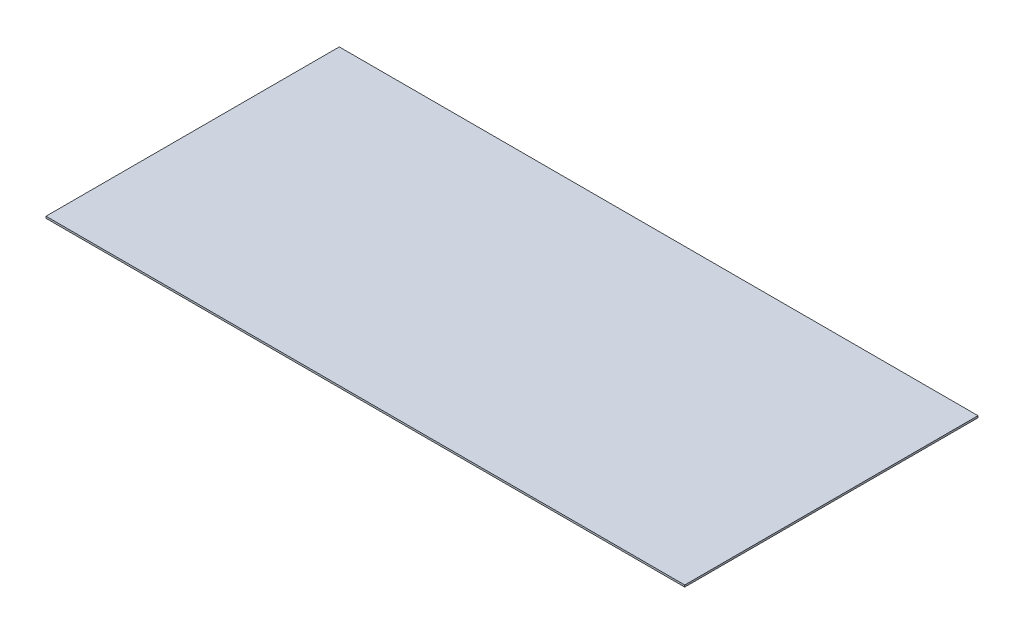
ISO-10303-21;
HEADER;
FILE_DESCRIPTION(('STEP AP214'),'2;1');
FILE_NAME('part.step','',(''),(''),'','','');
FILE_SCHEMA(('AUTOMOTIVE_DESIGN { 1 0 10303 214 1 1 1 1 }'));
ENDSEC;
DATA;
#1=APPLICATION_CONTEXT('core data for automotive mechanical design processes');
#2=APPLICATION_PROTOCOL_DEFINITION('international standard','automotive_design',2000,#1);
#3=PRODUCT_CONTEXT('',#1,'mechanical');
#4=PRODUCT('Part','Part','',(#3));
#5=PRODUCT_RELATED_PRODUCT_CATEGORY('part','',(#4));
#6=PRODUCT_DEFINITION_FORMATION('','',#4);
#7=PRODUCT_DEFINITION_CONTEXT('part definition',#1,'design');
#8=PRODUCT_DEFINITION('design','',#6,#7);
#9=PRODUCT_DEFINITION_SHAPE('','',#8);
#10=(LENGTH_UNIT() NAMED_UNIT(*) SI_UNIT(.MILLI.,.METRE.));
#11=(NAMED_UNIT(*) PLANE_ANGLE_UNIT() SI_UNIT($,.RADIAN.));
#12=(NAMED_UNIT(*) SI_UNIT($,.STERADIAN.) SOLID_ANGLE_UNIT());
#13=UNCERTAINTY_MEASURE_WITH_UNIT(LENGTH_MEASURE(1.E-05),#10,'distance_accuracy_value','');
#14=(GEOMETRIC_REPRESENTATION_CONTEXT(3) GLOBAL_UNCERTAINTY_ASSIGNED_CONTEXT((#13)) GLOBAL_UNIT_ASSIGNED_CONTEXT((#10,
#11,#12)) REPRESENTATION_CONTEXT('',''));
#15=CARTESIAN_POINT('',(0.,0.,0.));
#16=DIRECTION('',(0.,0.,1.));
#17=DIRECTION('',(1.,0.,0.));
#18=AXIS2_PLACEMENT_3D('',#15,#16,#17);
#19=CARTESIAN_POINT('',(0.,3.,0.));
#20=DIRECTION('',(-1.,0.,0.));
#21=DIRECTION('',(0.,0.,1.));
#22=AXIS2_PLACEMENT_3D('',#19,#20,#21);
#23=PLANE('',#22);
#24=DIRECTION('',(0.,0.,-1.));
#25=VECTOR('',#24,1.);
#26=CARTESIAN_POINT('',(0.,0.,0.));
#27=LINE('',#26,#25);
#28=CARTESIAN_POINT('',(0.,0.,472.));
#29=VERTEX_POINT('',#28);
#30=CARTESIAN_POINT('',(0.,0.,0.));
#31=VERTEX_POINT('',#30);
#32=EDGE_CURVE('E96',#29,#31,#27,.T.);
#33=ORIENTED_EDGE('',*,*,#32,.T.);
#34=DIRECTION('',(0.,-1.,0.));
#35=VECTOR('',#34,1.);
#36=CARTESIAN_POINT('',(0.,3.,0.));
#37=LINE('',#36,#35);
#38=CARTESIAN_POINT('',(0.,3.,0.));
#39=VERTEX_POINT('',#38);
#40=EDGE_CURVE('E11',#39,#31,#37,.T.);
#41=ORIENTED_EDGE('',*,*,#40,.F.);
#42=DIRECTION('',(0.,0.,-1.));
#43=VECTOR('',#42,1.);
#44=CARTESIAN_POINT('',(0.,3.,0.));
#45=LINE('',#44,#43);
#46=CARTESIAN_POINT('',(0.,3.,472.));
#47=VERTEX_POINT('',#46);
#48=EDGE_CURVE('E84',#47,#39,#45,.T.);
#49=ORIENTED_EDGE('',*,*,#48,.F.);
#50=DIRECTION('',(0.,-1.,0.));
#51=VECTOR('',#50,1.);
#52=CARTESIAN_POINT('',(0.,3.,472.));
#53=LINE('',#52,#51);
#54=EDGE_CURVE('E92',#47,#29,#53,.T.);
#55=ORIENTED_EDGE('',*,*,#54,.T.);
#56=EDGE_LOOP('',(#33,#41,#49,#55));
#57=FACE_BOUND('',#56,.T.);
#58=ADVANCED_FACE('F33',(#57),#23,.F.);
#59=CARTESIAN_POINT('',(0.,3.,0.));
#60=DIRECTION('',(0.,0.,1.));
#61=DIRECTION('',(1.,0.,0.));
#62=AXIS2_PLACEMENT_3D('',#59,#60,#61);
#63=PLANE('',#62);
#64=DIRECTION('',(-1.,0.,0.));
#65=VECTOR('',#64,1.);
#66=CARTESIAN_POINT('',(0.,0.,0.));
#67=LINE('',#66,#65);
#68=CARTESIAN_POINT('',(-1028.,0.,0.));
#69=VERTEX_POINT('',#68);
#70=EDGE_CURVE('E88',#31,#69,#67,.T.);
#71=ORIENTED_EDGE('',*,*,#70,.T.);
#72=DIRECTION('',(0.,-1.,0.));
#73=VECTOR('',#72,1.);
#74=CARTESIAN_POINT('',(-1028.,3.,0.));
#75=LINE('',#74,#73);
#76=CARTESIAN_POINT('',(-1028.,3.,0.));
#77=VERTEX_POINT('',#76);
#78=EDGE_CURVE('E41',#77,#69,#75,.T.);
#79=ORIENTED_EDGE('',*,*,#78,.F.);
#80=DIRECTION('',(-1.,0.,0.));
#81=VECTOR('',#80,1.);
#82=CARTESIAN_POINT('',(0.,3.,0.));
#83=LINE('',#82,#81);
#84=EDGE_CURVE('E79',#39,#77,#83,.T.);
#85=ORIENTED_EDGE('',*,*,#84,.F.);
#86=ORIENTED_EDGE('',*,*,#40,.T.);
#87=EDGE_LOOP('',(#71,#79,#85,#86));
#88=FACE_BOUND('',#87,.T.);
#89=ADVANCED_FACE('F87',(#88),#63,.F.);
#90=CARTESIAN_POINT('',(-1028.,3.,0.));
#91=DIRECTION('',(1.,0.,0.));
#92=DIRECTION('',(0.,0.,-1.));
#93=AXIS2_PLACEMENT_3D('',#90,#91,#92);
#94=PLANE('',#93);
#95=DIRECTION('',(0.,0.,1.));
#96=VECTOR('',#95,1.);
#97=CARTESIAN_POINT('',(-1028.,0.,0.));
#98=LINE('',#97,#96);
#99=CARTESIAN_POINT('',(-1028.,0.,472.));
#100=VERTEX_POINT('',#99);
#101=EDGE_CURVE('E66',#69,#100,#98,.T.);
#102=ORIENTED_EDGE('',*,*,#101,.T.);
#103=DIRECTION('',(0.,-1.,0.));
#104=VECTOR('',#103,1.);
#105=CARTESIAN_POINT('',(-1028.,3.,472.));
#106=LINE('',#105,#104);
#107=CARTESIAN_POINT('',(-1028.,3.,472.));
#108=VERTEX_POINT('',#107);
#109=EDGE_CURVE('E89',#108,#100,#106,.T.);
#110=ORIENTED_EDGE('',*,*,#109,.F.);
#111=DIRECTION('',(0.,0.,1.));
#112=VECTOR('',#111,1.);
#113=CARTESIAN_POINT('',(-1028.,3.,0.));
#114=LINE('',#113,#112);
#115=EDGE_CURVE('E82',#77,#108,#114,.T.);
#116=ORIENTED_EDGE('',*,*,#115,.F.);
#117=ORIENTED_EDGE('',*,*,#78,.T.);
#118=EDGE_LOOP('',(#102,#110,#116,#117));
#119=FACE_BOUND('',#118,.T.);
#120=ADVANCED_FACE('F90',(#119),#94,.F.);
#121=CARTESIAN_POINT('',(0.,3.,472.));
#122=DIRECTION('',(0.,0.,-1.));
#123=DIRECTION('',(-1.,0.,0.));
#124=AXIS2_PLACEMENT_3D('',#121,#122,#123);
#125=PLANE('',#124);
#126=DIRECTION('',(1.,0.,0.));
#127=VECTOR('',#126,1.);
#128=CARTESIAN_POINT('',(0.,0.,472.));
#129=LINE('',#128,#127);
#130=EDGE_CURVE('E72',#100,#29,#129,.T.);
#131=ORIENTED_EDGE('',*,*,#130,.T.);
#132=ORIENTED_EDGE('',*,*,#54,.F.);
#133=DIRECTION('',(1.,0.,0.));
#134=VECTOR('',#133,1.);
#135=CARTESIAN_POINT('',(0.,3.,472.));
#136=LINE('',#135,#134);
#137=EDGE_CURVE('E49',#108,#47,#136,.T.);
#138=ORIENTED_EDGE('',*,*,#137,.F.);
#139=ORIENTED_EDGE('',*,*,#109,.T.);
#140=EDGE_LOOP('',(#131,#132,#138,#139));
#141=FACE_BOUND('',#140,.T.);
#142=ADVANCED_FACE('F103',(#141),#125,.F.);
#143=CARTESIAN_POINT('',(0.,3.,0.));
#144=DIRECTION('',(0.,-1.,0.));
#145=DIRECTION('',(0.,0.,-1.));
#146=AXIS2_PLACEMENT_3D('',#143,#144,#145);
#147=PLANE('',#146);
#148=ORIENTED_EDGE('',*,*,#48,.T.);
#149=ORIENTED_EDGE('',*,*,#84,.T.);
#150=ORIENTED_EDGE('',*,*,#115,.T.);
#151=ORIENTED_EDGE('',*,*,#137,.T.);
#152=EDGE_LOOP('',(#148,#149,#150,#151));
#153=FACE_BOUND('',#152,.T.);
#154=ADVANCED_FACE('F80',(#153),#147,.F.);
#155=CARTESIAN_POINT('',(0.,0.,0.));
#156=DIRECTION('',(0.,-1.,0.));
#157=DIRECTION('',(0.,0.,-1.));
#158=AXIS2_PLACEMENT_3D('',#155,#156,#157);
#159=PLANE('',#158);
#160=ORIENTED_EDGE('',*,*,#32,.F.);
#161=ORIENTED_EDGE('',*,*,#130,.F.);
#162=ORIENTED_EDGE('',*,*,#101,.F.);
#163=ORIENTED_EDGE('',*,*,#70,.F.);
#164=EDGE_LOOP('',(#160,#161,#162,#163));
#165=FACE_BOUND('',#164,.T.);
#166=ADVANCED_FACE('F106',(#165),#159,.T.);
#167=CLOSED_SHELL('',(#58,#89,#120,#142,#154,#166));
#168=MANIFOLD_SOLID_BREP('B2',#167);
#169=ADVANCED_BREP_SHAPE_REPRESENTATION('',(#18,#168),#14);
#170=SHAPE_DEFINITION_REPRESENTATION(#9,#169);
ENDSEC;
END-ISO-10303-21;
